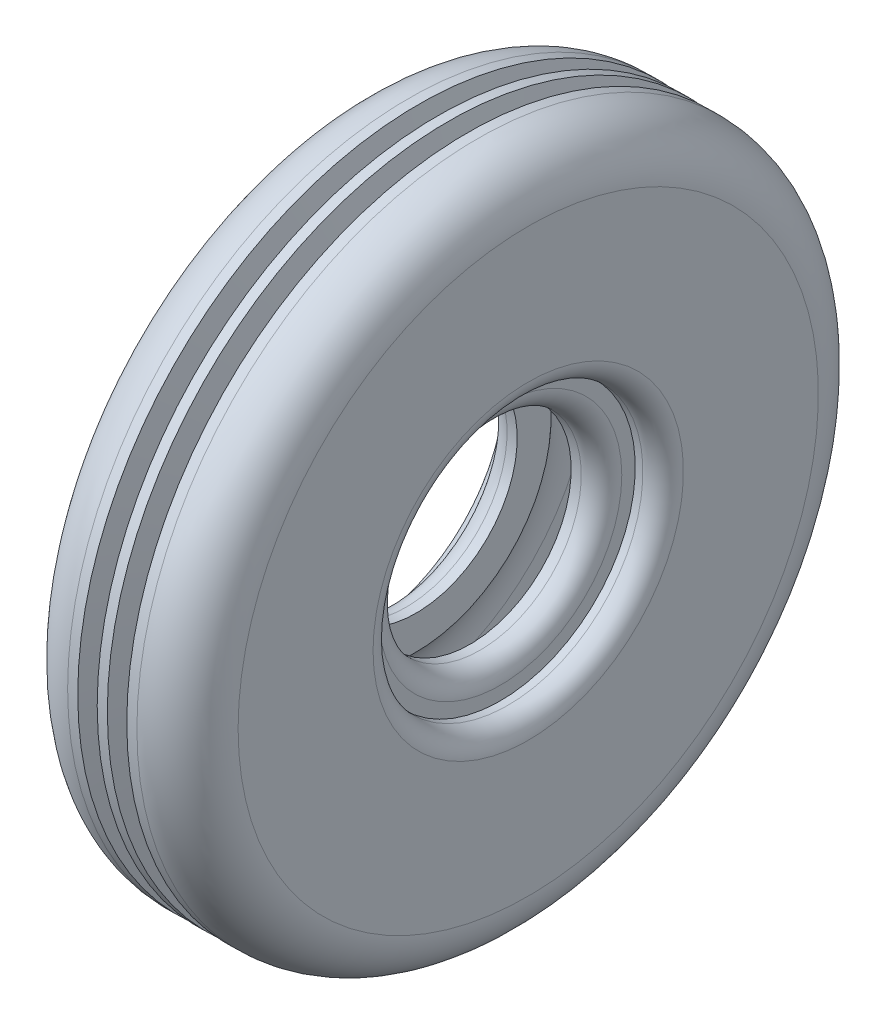
ISO-10303-21;
HEADER;
FILE_DESCRIPTION(('STEP AP214'),'2;1');
FILE_NAME('part.step','',(''),(''),'','','');
FILE_SCHEMA(('AUTOMOTIVE_DESIGN { 1 0 10303 214 1 1 1 1 }'));
ENDSEC;
DATA;
#1=APPLICATION_CONTEXT('core data for automotive mechanical design processes');
#2=APPLICATION_PROTOCOL_DEFINITION('international standard','automotive_design',2000,#1);
#3=PRODUCT_CONTEXT('',#1,'mechanical');
#4=PRODUCT('Part','Part','',(#3));
#5=PRODUCT_RELATED_PRODUCT_CATEGORY('part','',(#4));
#6=PRODUCT_DEFINITION_FORMATION('','',#4);
#7=PRODUCT_DEFINITION_CONTEXT('part definition',#1,'design');
#8=PRODUCT_DEFINITION('design','',#6,#7);
#9=PRODUCT_DEFINITION_SHAPE('','',#8);
#10=(LENGTH_UNIT() NAMED_UNIT(*) SI_UNIT(.MILLI.,.METRE.));
#11=(NAMED_UNIT(*) PLANE_ANGLE_UNIT() SI_UNIT($,.RADIAN.));
#12=(NAMED_UNIT(*) SI_UNIT($,.STERADIAN.) SOLID_ANGLE_UNIT());
#13=UNCERTAINTY_MEASURE_WITH_UNIT(LENGTH_MEASURE(1.E-05),#10,'distance_accuracy_value','');
#14=(GEOMETRIC_REPRESENTATION_CONTEXT(3) GLOBAL_UNCERTAINTY_ASSIGNED_CONTEXT((#13)) GLOBAL_UNIT_ASSIGNED_CONTEXT((#10,
#11,#12)) REPRESENTATION_CONTEXT('',''));
#15=CARTESIAN_POINT('',(0.,0.,0.));
#16=DIRECTION('',(0.,0.,1.));
#17=DIRECTION('',(1.,0.,0.));
#18=AXIS2_PLACEMENT_3D('',#15,#16,#17);
#19=CARTESIAN_POINT('',(166.89360179688,0.,0.));
#20=DIRECTION('',(-1.,0.,0.));
#21=DIRECTION('',(0.,0.,1.));
#22=AXIS2_PLACEMENT_3D('',#19,#20,#21);
#23=TOROIDAL_SURFACE('',#22,400.,30.);
#24=CARTESIAN_POINT('',(196.893601796879,0.,0.));
#25=DIRECTION('',(-1.,0.,0.));
#26=DIRECTION('',(0.,0.,1.));
#27=AXIS2_PLACEMENT_3D('',#24,#25,#26);
#28=CIRCLE('',#27,400.);
#29=CARTESIAN_POINT('',(196.893601796879,0.,400.));
#30=VERTEX_POINT('',#29);
#31=EDGE_CURVE('E140',#30,#30,#28,.T.);
#32=ORIENTED_EDGE('',*,*,#31,.F.);
#33=EDGE_LOOP('',(#32));
#34=FACE_BOUND('',#33,.T.);
#35=CARTESIAN_POINT('',(166.89360179688,0.,0.));
#36=DIRECTION('',(-1.,0.,0.));
#37=DIRECTION('',(0.,0.,1.));
#38=AXIS2_PLACEMENT_3D('',#35,#36,#37);
#39=CIRCLE('',#38,430.);
#40=CARTESIAN_POINT('',(166.89360179688,0.,430.));
#41=VERTEX_POINT('',#40);
#42=EDGE_CURVE('E10',#41,#41,#39,.T.);
#43=ORIENTED_EDGE('',*,*,#42,.T.);
#44=EDGE_LOOP('',(#43));
#45=FACE_BOUND('',#44,.T.);
#46=ADVANCED_FACE('F40',(#34,#45),#23,.F.);
#47=CARTESIAN_POINT('',(0.,0.,0.));
#48=DIRECTION('',(-1.,0.,0.));
#49=DIRECTION('',(0.,0.,1.));
#50=AXIS2_PLACEMENT_3D('',#47,#48,#49);
#51=CYLINDRICAL_SURFACE('',#50,430.);
#52=ORIENTED_EDGE('',*,*,#42,.F.);
#53=EDGE_LOOP('',(#52));
#54=FACE_BOUND('',#53,.T.);
#55=CARTESIAN_POINT('',(64.2383757738819,0.,0.));
#56=DIRECTION('',(-1.,0.,0.));
#57=DIRECTION('',(0.,0.,1.));
#58=AXIS2_PLACEMENT_3D('',#55,#56,#57);
#59=CIRCLE('',#58,430.);
#60=CARTESIAN_POINT('',(64.2383757738819,0.,430.));
#61=VERTEX_POINT('',#60);
#62=EDGE_CURVE('E43',#61,#61,#59,.T.);
#63=ORIENTED_EDGE('',*,*,#62,.T.);
#64=EDGE_LOOP('',(#63));
#65=FACE_BOUND('',#64,.T.);
#66=ADVANCED_FACE('F145',(#54,#65),#51,.F.);
#67=CARTESIAN_POINT('',(64.2383757738819,0.,0.));
#68=DIRECTION('',(-1.,0.,0.));
#69=DIRECTION('',(0.,0.,1.));
#70=AXIS2_PLACEMENT_3D('',#67,#68,#69);
#71=TOROIDAL_SURFACE('',#70,400.,30.);
#72=ORIENTED_EDGE('',*,*,#62,.F.);
#73=EDGE_LOOP('',(#72));
#74=FACE_BOUND('',#73,.T.);
#75=CARTESIAN_POINT('',(34.2383757738819,0.,0.));
#76=DIRECTION('',(-1.,0.,0.));
#77=DIRECTION('',(0.,0.,1.));
#78=AXIS2_PLACEMENT_3D('',#75,#76,#77);
#79=CIRCLE('',#78,400.);
#80=CARTESIAN_POINT('',(34.2383757738819,0.,400.));
#81=VERTEX_POINT('',#80);
#82=EDGE_CURVE('E50',#81,#81,#79,.T.);
#83=ORIENTED_EDGE('',*,*,#82,.T.);
#84=EDGE_LOOP('',(#83));
#85=FACE_BOUND('',#84,.T.);
#86=ADVANCED_FACE('F146',(#74,#85),#71,.F.);
#87=CARTESIAN_POINT('',(34.2383757738819,400.,0.));
#88=DIRECTION('',(-1.,0.,0.));
#89=DIRECTION('',(0.,0.,1.));
#90=AXIS2_PLACEMENT_3D('',#87,#88,#89);
#91=PLANE('',#90);
#92=ORIENTED_EDGE('',*,*,#82,.F.);
#93=EDGE_LOOP('',(#92));
#94=FACE_BOUND('',#93,.T.);
#95=CARTESIAN_POINT('',(34.2383757738819,0.,0.));
#96=DIRECTION('',(-1.,0.,0.));
#97=DIRECTION('',(0.,0.,1.));
#98=AXIS2_PLACEMENT_3D('',#95,#96,#97);
#99=CIRCLE('',#98,300.);
#100=CARTESIAN_POINT('',(34.2383757738819,0.,300.));
#101=VERTEX_POINT('',#100);
#102=EDGE_CURVE('E51',#101,#101,#99,.T.);
#103=ORIENTED_EDGE('',*,*,#102,.T.);
#104=EDGE_LOOP('',(#103));
#105=FACE_BOUND('',#104,.T.);
#106=ADVANCED_FACE('F153',(#94,#105),#91,.F.);
#107=CARTESIAN_POINT('',(175.886667848852,0.,0.));
#108=DIRECTION('',(-1.,0.,0.));
#109=DIRECTION('',(0.,0.,1.));
#110=AXIS2_PLACEMENT_3D('',#107,#108,#109);
#111=TOROIDAL_SURFACE('',#110,300.,141.64829207497);
#112=ORIENTED_EDGE('',*,*,#102,.F.);
#113=EDGE_LOOP('',(#112));
#114=FACE_BOUND('',#113,.T.);
#115=CARTESIAN_POINT('',(75.5659887853808,0.,0.));
#116=DIRECTION('',(-1.,0.,0.));
#117=DIRECTION('',(0.,0.,1.));
#118=AXIS2_PLACEMENT_3D('',#115,#116,#117);
#119=CIRCLE('',#118,200.);
#120=CARTESIAN_POINT('',(75.5659887853808,0.,200.));
#121=VERTEX_POINT('',#120);
#122=EDGE_CURVE('E57',#121,#121,#119,.T.);
#123=ORIENTED_EDGE('',*,*,#122,.T.);
#124=EDGE_LOOP('',(#123));
#125=FACE_BOUND('',#124,.T.);
#126=ADVANCED_FACE('F157',(#114,#125),#111,.F.);
#127=CARTESIAN_POINT('',(75.5659887853808,150.,0.));
#128=DIRECTION('',(-1.,0.,0.));
#129=DIRECTION('',(0.,0.,1.));
#130=AXIS2_PLACEMENT_3D('',#127,#128,#129);
#131=PLANE('',#130);
#132=ORIENTED_EDGE('',*,*,#122,.F.);
#133=EDGE_LOOP('',(#132));
#134=FACE_BOUND('',#133,.T.);
#135=CARTESIAN_POINT('',(75.5659887853808,0.,0.));
#136=DIRECTION('',(-1.,0.,0.));
#137=DIRECTION('',(0.,0.,1.));
#138=AXIS2_PLACEMENT_3D('',#135,#136,#137);
#139=CIRCLE('',#138,150.);
#140=CARTESIAN_POINT('',(75.5659887853808,0.,150.));
#141=VERTEX_POINT('',#140);
#142=EDGE_CURVE('E56',#141,#141,#139,.T.);
#143=ORIENTED_EDGE('',*,*,#142,.T.);
#144=EDGE_LOOP('',(#143));
#145=FACE_BOUND('',#144,.T.);
#146=ADVANCED_FACE('F162',(#134,#145),#131,.F.);
#147=CARTESIAN_POINT('',(0.,0.,0.));
#148=DIRECTION('',(-1.,0.,0.));
#149=DIRECTION('',(0.,0.,1.));
#150=AXIS2_PLACEMENT_3D('',#147,#148,#149);
#151=CYLINDRICAL_SURFACE('',#150,150.);
#152=ORIENTED_EDGE('',*,*,#142,.F.);
#153=EDGE_LOOP('',(#152));
#154=FACE_BOUND('',#153,.T.);
#155=CARTESIAN_POINT('',(60.5659887853808,0.,0.));
#156=DIRECTION('',(-1.,0.,0.));
#157=DIRECTION('',(0.,0.,1.));
#158=AXIS2_PLACEMENT_3D('',#155,#156,#157);
#159=CIRCLE('',#158,150.);
#160=CARTESIAN_POINT('',(60.5659887853808,0.,150.));
#161=VERTEX_POINT('',#160);
#162=EDGE_CURVE('E64',#161,#161,#159,.T.);
#163=ORIENTED_EDGE('',*,*,#162,.T.);
#164=EDGE_LOOP('',(#163));
#165=FACE_BOUND('',#164,.T.);
#166=ADVANCED_FACE('F170',(#154,#165),#151,.F.);
#167=CARTESIAN_POINT('',(60.5659887853808,0.,0.));
#168=DIRECTION('',(-1.,0.,0.));
#169=DIRECTION('',(0.,0.,1.));
#170=AXIS2_PLACEMENT_3D('',#167,#168,#169);
#171=TOROIDAL_SURFACE('',#170,180.,30.);
#172=ORIENTED_EDGE('',*,*,#162,.F.);
#173=EDGE_LOOP('',(#172));
#174=FACE_BOUND('',#173,.T.);
#175=CARTESIAN_POINT('',(30.5659887853808,0.,0.));
#176=DIRECTION('',(-1.,0.,0.));
#177=DIRECTION('',(0.,0.,1.));
#178=AXIS2_PLACEMENT_3D('',#175,#176,#177);
#179=CIRCLE('',#178,180.);
#180=CARTESIAN_POINT('',(30.5659887853808,0.,180.));
#181=VERTEX_POINT('',#180);
#182=EDGE_CURVE('E61',#181,#181,#179,.T.);
#183=ORIENTED_EDGE('',*,*,#182,.T.);
#184=EDGE_LOOP('',(#183));
#185=FACE_BOUND('',#184,.T.);
#186=ADVANCED_FACE('F173',(#174,#185),#171,.T.);
#187=CARTESIAN_POINT('',(30.5659887853808,200.,0.));
#188=DIRECTION('',(1.,0.,0.));
#189=DIRECTION('',(0.,0.,-1.));
#190=AXIS2_PLACEMENT_3D('',#187,#188,#189);
#191=PLANE('',#190);
#192=ORIENTED_EDGE('',*,*,#182,.F.);
#193=EDGE_LOOP('',(#192));
#194=FACE_BOUND('',#193,.T.);
#195=CARTESIAN_POINT('',(30.5659887853808,0.,0.));
#196=DIRECTION('',(-1.,0.,0.));
#197=DIRECTION('',(0.,0.,1.));
#198=AXIS2_PLACEMENT_3D('',#195,#196,#197);
#199=CIRCLE('',#198,200.);
#200=CARTESIAN_POINT('',(30.5659887853808,0.,200.));
#201=VERTEX_POINT('',#200);
#202=EDGE_CURVE('E66',#201,#201,#199,.T.);
#203=ORIENTED_EDGE('',*,*,#202,.T.);
#204=EDGE_LOOP('',(#203));
#205=FACE_BOUND('',#204,.T.);
#206=ADVANCED_FACE('F171',(#194,#205),#191,.F.);
#207=CARTESIAN_POINT('',(0.,0.,0.));
#208=DIRECTION('',(-1.,0.,0.));
#209=DIRECTION('',(0.,0.,1.));
#210=AXIS2_PLACEMENT_3D('',#207,#208,#209);
#211=CYLINDRICAL_SURFACE('',#210,200.);
#212=ORIENTED_EDGE('',*,*,#202,.F.);
#213=EDGE_LOOP('',(#212));
#214=FACE_BOUND('',#213,.T.);
#215=CARTESIAN_POINT('',(19.238375773882,0.,0.));
#216=DIRECTION('',(-1.,0.,0.));
#217=DIRECTION('',(0.,0.,1.));
#218=AXIS2_PLACEMENT_3D('',#215,#216,#217);
#219=CIRCLE('',#218,200.);
#220=CARTESIAN_POINT('',(19.238375773882,0.,200.));
#221=VERTEX_POINT('',#220);
#222=EDGE_CURVE('E72',#221,#221,#219,.T.);
#223=ORIENTED_EDGE('',*,*,#222,.T.);
#224=EDGE_LOOP('',(#223));
#225=FACE_BOUND('',#224,.T.);
#226=ADVANCED_FACE('F177',(#214,#225),#211,.F.);
#227=CARTESIAN_POINT('',(19.238375773882,0.,0.));
#228=DIRECTION('',(-1.,0.,0.));
#229=DIRECTION('',(0.,0.,1.));
#230=AXIS2_PLACEMENT_3D('',#227,#228,#229);
#231=TOROIDAL_SURFACE('',#230,230.,30.);
#232=ORIENTED_EDGE('',*,*,#222,.F.);
#233=EDGE_LOOP('',(#232));
#234=FACE_BOUND('',#233,.T.);
#235=CARTESIAN_POINT('',(-10.761624226118,0.,0.));
#236=DIRECTION('',(-1.,0.,0.));
#237=DIRECTION('',(0.,0.,1.));
#238=AXIS2_PLACEMENT_3D('',#235,#236,#237);
#239=CIRCLE('',#238,230.);
#240=CARTESIAN_POINT('',(-10.761624226118,0.,230.));
#241=VERTEX_POINT('',#240);
#242=EDGE_CURVE('E74',#241,#241,#239,.T.);
#243=ORIENTED_EDGE('',*,*,#242,.T.);
#244=EDGE_LOOP('',(#243));
#245=FACE_BOUND('',#244,.T.);
#246=ADVANCED_FACE('F181',(#234,#245),#231,.T.);
#247=CARTESIAN_POINT('',(-10.761624226118,430.,0.));
#248=DIRECTION('',(1.,0.,0.));
#249=DIRECTION('',(0.,0.,-1.));
#250=AXIS2_PLACEMENT_3D('',#247,#248,#249);
#251=PLANE('',#250);
#252=ORIENTED_EDGE('',*,*,#242,.F.);
#253=EDGE_LOOP('',(#252));
#254=FACE_BOUND('',#253,.T.);
#255=CARTESIAN_POINT('',(-10.7616242261181,0.,0.));
#256=DIRECTION('',(-1.,0.,0.));
#257=DIRECTION('',(0.,0.,1.));
#258=AXIS2_PLACEMENT_3D('',#255,#256,#257);
#259=CIRCLE('',#258,430.);
#260=CARTESIAN_POINT('',(-10.7616242261181,0.,430.));
#261=VERTEX_POINT('',#260);
#262=EDGE_CURVE('E79',#261,#261,#259,.T.);
#263=ORIENTED_EDGE('',*,*,#262,.T.);
#264=EDGE_LOOP('',(#263));
#265=FACE_BOUND('',#264,.T.);
#266=ADVANCED_FACE('F189',(#254,#265),#251,.F.);
#267=CARTESIAN_POINT('',(64.2383757738819,0.,0.));
#268=DIRECTION('',(-1.,0.,0.));
#269=DIRECTION('',(0.,0.,1.));
#270=AXIS2_PLACEMENT_3D('',#267,#268,#269);
#271=TOROIDAL_SURFACE('',#270,430.,75.);
#272=ORIENTED_EDGE('',*,*,#262,.F.);
#273=EDGE_LOOP('',(#272));
#274=FACE_BOUND('',#273,.T.);
#275=CARTESIAN_POINT('',(64.2383757738819,0.,0.));
#276=DIRECTION('',(-1.,0.,0.));
#277=DIRECTION('',(0.,0.,1.));
#278=AXIS2_PLACEMENT_3D('',#275,#276,#277);
#279=CIRCLE('',#278,505.);
#280=CARTESIAN_POINT('',(64.2383757738819,0.,505.));
#281=VERTEX_POINT('',#280);
#282=EDGE_CURVE('E76',#281,#281,#279,.T.);
#283=ORIENTED_EDGE('',*,*,#282,.T.);
#284=EDGE_LOOP('',(#283));
#285=FACE_BOUND('',#284,.T.);
#286=ADVANCED_FACE('F193',(#274,#285),#271,.T.);
#287=CARTESIAN_POINT('',(0.,0.,0.));
#288=DIRECTION('',(-1.,0.,0.));
#289=DIRECTION('',(0.,0.,1.));
#290=AXIS2_PLACEMENT_3D('',#287,#288,#289);
#291=CYLINDRICAL_SURFACE('',#290,505.);
#292=ORIENTED_EDGE('',*,*,#282,.F.);
#293=EDGE_LOOP('',(#292));
#294=FACE_BOUND('',#293,.T.);
#295=CARTESIAN_POINT('',(79.2383757738819,0.,0.));
#296=DIRECTION('',(-1.,0.,0.));
#297=DIRECTION('',(0.,0.,1.));
#298=AXIS2_PLACEMENT_3D('',#295,#296,#297);
#299=CIRCLE('',#298,505.);
#300=CARTESIAN_POINT('',(79.2383757738819,0.,505.));
#301=VERTEX_POINT('',#300);
#302=EDGE_CURVE('E81',#301,#301,#299,.T.);
#303=ORIENTED_EDGE('',*,*,#302,.T.);
#304=EDGE_LOOP('',(#303));
#305=FACE_BOUND('',#304,.T.);
#306=ADVANCED_FACE('F194',(#294,#305),#291,.T.);
#307=CARTESIAN_POINT('',(88.6521822796312,0.,0.));
#308=DIRECTION('',(-1.,0.,0.));
#309=DIRECTION('',(0.,0.,1.));
#310=AXIS2_PLACEMENT_3D('',#307,#308,#309);
#311=CONICAL_SURFACE('',#310,466.12352578908,1.33322263615598);
#312=ORIENTED_EDGE('',*,*,#302,.F.);
#313=EDGE_LOOP('',(#312));
#314=FACE_BOUND('',#313,.T.);
#315=CARTESIAN_POINT('',(88.6521822796312,0.,0.));
#316=DIRECTION('',(-1.,0.,0.));
#317=DIRECTION('',(0.,0.,1.));
#318=AXIS2_PLACEMENT_3D('',#315,#316,#317);
#319=CIRCLE('',#318,466.12352578908);
#320=CARTESIAN_POINT('',(88.6521822796312,0.,466.12352578908));
#321=VERTEX_POINT('',#320);
#322=EDGE_CURVE('E88',#321,#321,#319,.T.);
#323=ORIENTED_EDGE('',*,*,#322,.T.);
#324=EDGE_LOOP('',(#323));
#325=FACE_BOUND('',#324,.T.);
#326=ADVANCED_FACE('F200',(#314,#325),#311,.T.);
#327=CARTESIAN_POINT('',(0.,0.,0.));
#328=DIRECTION('',(-1.,0.,0.));
#329=DIRECTION('',(0.,0.,1.));
#330=AXIS2_PLACEMENT_3D('',#327,#328,#329);
#331=CYLINDRICAL_SURFACE('',#330,466.12352578908);
#332=ORIENTED_EDGE('',*,*,#322,.F.);
#333=EDGE_LOOP('',(#332));
#334=FACE_BOUND('',#333,.T.);
#335=CARTESIAN_POINT('',(98.6521822796312,0.,0.));
#336=DIRECTION('',(-1.,0.,0.));
#337=DIRECTION('',(0.,0.,1.));
#338=AXIS2_PLACEMENT_3D('',#335,#336,#337);
#339=CIRCLE('',#338,466.12352578908);
#340=CARTESIAN_POINT('',(98.6521822796312,0.,466.12352578908));
#341=VERTEX_POINT('',#340);
#342=EDGE_CURVE('E90',#341,#341,#339,.T.);
#343=ORIENTED_EDGE('',*,*,#342,.T.);
#344=EDGE_LOOP('',(#343));
#345=FACE_BOUND('',#344,.T.);
#346=ADVANCED_FACE('F201',(#334,#345),#331,.T.);
#347=CARTESIAN_POINT('',(108.065988785381,0.,0.));
#348=DIRECTION('',(1.,0.,0.));
#349=DIRECTION('',(0.,0.,-1.));
#350=AXIS2_PLACEMENT_3D('',#347,#348,#349);
#351=CONICAL_SURFACE('',#350,505.,1.33322263615598);
#352=ORIENTED_EDGE('',*,*,#342,.F.);
#353=EDGE_LOOP('',(#352));
#354=FACE_BOUND('',#353,.T.);
#355=CARTESIAN_POINT('',(108.065988785381,0.,0.));
#356=DIRECTION('',(-1.,0.,0.));
#357=DIRECTION('',(0.,0.,1.));
#358=AXIS2_PLACEMENT_3D('',#355,#356,#357);
#359=CIRCLE('',#358,505.);
#360=CARTESIAN_POINT('',(108.065988785381,0.,505.));
#361=VERTEX_POINT('',#360);
#362=EDGE_CURVE('E95',#361,#361,#359,.T.);
#363=ORIENTED_EDGE('',*,*,#362,.T.);
#364=EDGE_LOOP('',(#363));
#365=FACE_BOUND('',#364,.T.);
#366=ADVANCED_FACE('F210',(#354,#365),#351,.T.);
#367=CARTESIAN_POINT('',(0.,0.,0.));
#368=DIRECTION('',(-1.,0.,0.));
#369=DIRECTION('',(0.,0.,1.));
#370=AXIS2_PLACEMENT_3D('',#367,#368,#369);
#371=CYLINDRICAL_SURFACE('',#370,505.);
#372=ORIENTED_EDGE('',*,*,#362,.F.);
#373=EDGE_LOOP('',(#372));
#374=FACE_BOUND('',#373,.T.);
#375=CARTESIAN_POINT('',(123.065988785381,0.,0.));
#376=DIRECTION('',(-1.,0.,0.));
#377=DIRECTION('',(0.,0.,1.));
#378=AXIS2_PLACEMENT_3D('',#375,#376,#377);
#379=CIRCLE('',#378,505.);
#380=CARTESIAN_POINT('',(123.065988785381,0.,505.));
#381=VERTEX_POINT('',#380);
#382=EDGE_CURVE('E92',#381,#381,#379,.T.);
#383=ORIENTED_EDGE('',*,*,#382,.T.);
#384=EDGE_LOOP('',(#383));
#385=FACE_BOUND('',#384,.T.);
#386=ADVANCED_FACE('F211',(#374,#385),#371,.T.);
#387=CARTESIAN_POINT('',(132.47979529113,0.,0.));
#388=DIRECTION('',(-1.,0.,0.));
#389=DIRECTION('',(0.,0.,1.));
#390=AXIS2_PLACEMENT_3D('',#387,#388,#389);
#391=CONICAL_SURFACE('',#390,466.12352578908,1.33322263615597);
#392=ORIENTED_EDGE('',*,*,#382,.F.);
#393=EDGE_LOOP('',(#392));
#394=FACE_BOUND('',#393,.T.);
#395=CARTESIAN_POINT('',(132.47979529113,0.,0.));
#396=DIRECTION('',(-1.,0.,0.));
#397=DIRECTION('',(0.,0.,1.));
#398=AXIS2_PLACEMENT_3D('',#395,#396,#397);
#399=CIRCLE('',#398,466.12352578908);
#400=CARTESIAN_POINT('',(132.47979529113,0.,466.12352578908));
#401=VERTEX_POINT('',#400);
#402=EDGE_CURVE('E98',#401,#401,#399,.T.);
#403=ORIENTED_EDGE('',*,*,#402,.T.);
#404=EDGE_LOOP('',(#403));
#405=FACE_BOUND('',#404,.T.);
#406=ADVANCED_FACE('F214',(#394,#405),#391,.T.);
#407=CARTESIAN_POINT('',(0.,0.,0.));
#408=DIRECTION('',(-1.,0.,0.));
#409=DIRECTION('',(0.,0.,1.));
#410=AXIS2_PLACEMENT_3D('',#407,#408,#409);
#411=CYLINDRICAL_SURFACE('',#410,466.12352578908);
#412=ORIENTED_EDGE('',*,*,#402,.F.);
#413=EDGE_LOOP('',(#412));
#414=FACE_BOUND('',#413,.T.);
#415=CARTESIAN_POINT('',(142.47979529113,0.,0.));
#416=DIRECTION('',(-1.,0.,0.));
#417=DIRECTION('',(0.,0.,1.));
#418=AXIS2_PLACEMENT_3D('',#415,#416,#417);
#419=CIRCLE('',#418,466.12352578908);
#420=CARTESIAN_POINT('',(142.47979529113,0.,466.12352578908));
#421=VERTEX_POINT('',#420);
#422=EDGE_CURVE('E101',#421,#421,#419,.T.);
#423=ORIENTED_EDGE('',*,*,#422,.T.);
#424=EDGE_LOOP('',(#423));
#425=FACE_BOUND('',#424,.T.);
#426=ADVANCED_FACE('F218',(#414,#425),#411,.T.);
#427=CARTESIAN_POINT('',(151.893601796879,0.,0.));
#428=DIRECTION('',(1.,0.,0.));
#429=DIRECTION('',(0.,0.,-1.));
#430=AXIS2_PLACEMENT_3D('',#427,#428,#429);
#431=CONICAL_SURFACE('',#430,505.,1.33322263615597);
#432=ORIENTED_EDGE('',*,*,#422,.F.);
#433=EDGE_LOOP('',(#432));
#434=FACE_BOUND('',#433,.T.);
#435=CARTESIAN_POINT('',(151.893601796879,0.,0.));
#436=DIRECTION('',(-1.,0.,0.));
#437=DIRECTION('',(0.,0.,1.));
#438=AXIS2_PLACEMENT_3D('',#435,#436,#437);
#439=CIRCLE('',#438,505.);
#440=CARTESIAN_POINT('',(151.893601796879,0.,505.));
#441=VERTEX_POINT('',#440);
#442=EDGE_CURVE('E102',#441,#441,#439,.T.);
#443=ORIENTED_EDGE('',*,*,#442,.T.);
#444=EDGE_LOOP('',(#443));
#445=FACE_BOUND('',#444,.T.);
#446=ADVANCED_FACE('F224',(#434,#445),#431,.T.);
#447=CARTESIAN_POINT('',(0.,0.,0.));
#448=DIRECTION('',(-1.,0.,0.));
#449=DIRECTION('',(0.,0.,1.));
#450=AXIS2_PLACEMENT_3D('',#447,#448,#449);
#451=CYLINDRICAL_SURFACE('',#450,505.);
#452=ORIENTED_EDGE('',*,*,#442,.F.);
#453=EDGE_LOOP('',(#452));
#454=FACE_BOUND('',#453,.T.);
#455=CARTESIAN_POINT('',(166.893601796879,0.,0.));
#456=DIRECTION('',(-1.,0.,0.));
#457=DIRECTION('',(0.,0.,1.));
#458=AXIS2_PLACEMENT_3D('',#455,#456,#457);
#459=CIRCLE('',#458,505.);
#460=CARTESIAN_POINT('',(166.893601796879,0.,505.));
#461=VERTEX_POINT('',#460);
#462=EDGE_CURVE('E110',#461,#461,#459,.T.);
#463=ORIENTED_EDGE('',*,*,#462,.T.);
#464=EDGE_LOOP('',(#463));
#465=FACE_BOUND('',#464,.T.);
#466=ADVANCED_FACE('F229',(#454,#465),#451,.T.);
#467=CARTESIAN_POINT('',(166.89360179688,0.,0.));
#468=DIRECTION('',(-1.,0.,0.));
#469=DIRECTION('',(0.,0.,1.));
#470=AXIS2_PLACEMENT_3D('',#467,#468,#469);
#471=TOROIDAL_SURFACE('',#470,430.,75.);
#472=ORIENTED_EDGE('',*,*,#462,.F.);
#473=EDGE_LOOP('',(#472));
#474=FACE_BOUND('',#473,.T.);
#475=CARTESIAN_POINT('',(241.893601796879,0.,0.));
#476=DIRECTION('',(-1.,0.,0.));
#477=DIRECTION('',(0.,0.,1.));
#478=AXIS2_PLACEMENT_3D('',#475,#476,#477);
#479=CIRCLE('',#478,430.);
#480=CARTESIAN_POINT('',(241.893601796879,0.,430.));
#481=VERTEX_POINT('',#480);
#482=EDGE_CURVE('E109',#481,#481,#479,.T.);
#483=ORIENTED_EDGE('',*,*,#482,.T.);
#484=EDGE_LOOP('',(#483));
#485=FACE_BOUND('',#484,.T.);
#486=ADVANCED_FACE('F233',(#474,#485),#471,.T.);
#487=CARTESIAN_POINT('',(241.89360179688,230.,0.));
#488=DIRECTION('',(-1.,0.,0.));
#489=DIRECTION('',(0.,0.,1.));
#490=AXIS2_PLACEMENT_3D('',#487,#488,#489);
#491=PLANE('',#490);
#492=ORIENTED_EDGE('',*,*,#482,.F.);
#493=EDGE_LOOP('',(#492));
#494=FACE_BOUND('',#493,.T.);
#495=CARTESIAN_POINT('',(241.89360179688,0.,0.));
#496=DIRECTION('',(-1.,0.,0.));
#497=DIRECTION('',(0.,0.,1.));
#498=AXIS2_PLACEMENT_3D('',#495,#496,#497);
#499=CIRCLE('',#498,230.);
#500=CARTESIAN_POINT('',(241.89360179688,0.,230.));
#501=VERTEX_POINT('',#500);
#502=EDGE_CURVE('E114',#501,#501,#499,.T.);
#503=ORIENTED_EDGE('',*,*,#502,.T.);
#504=EDGE_LOOP('',(#503));
#505=FACE_BOUND('',#504,.T.);
#506=ADVANCED_FACE('F234',(#494,#505),#491,.F.);
#507=CARTESIAN_POINT('',(211.89360179688,0.,0.));
#508=DIRECTION('',(-1.,0.,0.));
#509=DIRECTION('',(0.,0.,1.));
#510=AXIS2_PLACEMENT_3D('',#507,#508,#509);
#511=TOROIDAL_SURFACE('',#510,230.,30.);
#512=ORIENTED_EDGE('',*,*,#502,.F.);
#513=EDGE_LOOP('',(#512));
#514=FACE_BOUND('',#513,.T.);
#515=CARTESIAN_POINT('',(211.89360179688,0.,0.));
#516=DIRECTION('',(-1.,0.,0.));
#517=DIRECTION('',(0.,0.,1.));
#518=AXIS2_PLACEMENT_3D('',#515,#516,#517);
#519=CIRCLE('',#518,200.);
#520=CARTESIAN_POINT('',(211.89360179688,0.,200.));
#521=VERTEX_POINT('',#520);
#522=EDGE_CURVE('E118',#521,#521,#519,.T.);
#523=ORIENTED_EDGE('',*,*,#522,.T.);
#524=EDGE_LOOP('',(#523));
#525=FACE_BOUND('',#524,.T.);
#526=ADVANCED_FACE('F239',(#514,#525),#511,.T.);
#527=CARTESIAN_POINT('',(0.,0.,0.));
#528=DIRECTION('',(-1.,0.,0.));
#529=DIRECTION('',(0.,0.,1.));
#530=AXIS2_PLACEMENT_3D('',#527,#528,#529);
#531=CYLINDRICAL_SURFACE('',#530,200.);
#532=ORIENTED_EDGE('',*,*,#522,.F.);
#533=EDGE_LOOP('',(#532));
#534=FACE_BOUND('',#533,.T.);
#535=CARTESIAN_POINT('',(200.565988785381,0.,0.));
#536=DIRECTION('',(-1.,0.,0.));
#537=DIRECTION('',(0.,0.,1.));
#538=AXIS2_PLACEMENT_3D('',#535,#536,#537);
#539=CIRCLE('',#538,200.);
#540=CARTESIAN_POINT('',(200.565988785381,0.,200.));
#541=VERTEX_POINT('',#540);
#542=EDGE_CURVE('E120',#541,#541,#539,.T.);
#543=ORIENTED_EDGE('',*,*,#542,.T.);
#544=EDGE_LOOP('',(#543));
#545=FACE_BOUND('',#544,.T.);
#546=ADVANCED_FACE('F242',(#534,#545),#531,.F.);
#547=CARTESIAN_POINT('',(200.565988785381,200.,0.));
#548=DIRECTION('',(-1.,0.,0.));
#549=DIRECTION('',(0.,0.,1.));
#550=AXIS2_PLACEMENT_3D('',#547,#548,#549);
#551=PLANE('',#550);
#552=ORIENTED_EDGE('',*,*,#542,.F.);
#553=EDGE_LOOP('',(#552));
#554=FACE_BOUND('',#553,.T.);
#555=CARTESIAN_POINT('',(200.565988785381,0.,0.));
#556=DIRECTION('',(-1.,0.,0.));
#557=DIRECTION('',(0.,0.,1.));
#558=AXIS2_PLACEMENT_3D('',#555,#556,#557);
#559=CIRCLE('',#558,180.);
#560=CARTESIAN_POINT('',(200.565988785381,0.,180.));
#561=VERTEX_POINT('',#560);
#562=EDGE_CURVE('E125',#561,#561,#559,.T.);
#563=ORIENTED_EDGE('',*,*,#562,.T.);
#564=EDGE_LOOP('',(#563));
#565=FACE_BOUND('',#564,.T.);
#566=ADVANCED_FACE('F250',(#554,#565),#551,.F.);
#567=CARTESIAN_POINT('',(170.565988785381,0.,0.));
#568=DIRECTION('',(-1.,0.,0.));
#569=DIRECTION('',(0.,0.,1.));
#570=AXIS2_PLACEMENT_3D('',#567,#568,#569);
#571=TOROIDAL_SURFACE('',#570,180.,30.);
#572=ORIENTED_EDGE('',*,*,#562,.F.);
#573=EDGE_LOOP('',(#572));
#574=FACE_BOUND('',#573,.T.);
#575=CARTESIAN_POINT('',(170.565988785381,0.,0.));
#576=DIRECTION('',(-1.,0.,0.));
#577=DIRECTION('',(0.,0.,1.));
#578=AXIS2_PLACEMENT_3D('',#575,#576,#577);
#579=CIRCLE('',#578,150.);
#580=CARTESIAN_POINT('',(170.565988785381,0.,150.));
#581=VERTEX_POINT('',#580);
#582=EDGE_CURVE('E124',#581,#581,#579,.T.);
#583=ORIENTED_EDGE('',*,*,#582,.T.);
#584=EDGE_LOOP('',(#583));
#585=FACE_BOUND('',#584,.T.);
#586=ADVANCED_FACE('F253',(#574,#585),#571,.T.);
#587=CARTESIAN_POINT('',(0.,0.,0.));
#588=DIRECTION('',(-1.,0.,0.));
#589=DIRECTION('',(0.,0.,1.));
#590=AXIS2_PLACEMENT_3D('',#587,#588,#589);
#591=CYLINDRICAL_SURFACE('',#590,150.);
#592=ORIENTED_EDGE('',*,*,#582,.F.);
#593=EDGE_LOOP('',(#592));
#594=FACE_BOUND('',#593,.T.);
#595=CARTESIAN_POINT('',(155.565988785381,0.,0.));
#596=DIRECTION('',(-1.,0.,0.));
#597=DIRECTION('',(0.,0.,1.));
#598=AXIS2_PLACEMENT_3D('',#595,#596,#597);
#599=CIRCLE('',#598,150.);
#600=CARTESIAN_POINT('',(155.565988785381,0.,150.));
#601=VERTEX_POINT('',#600);
#602=EDGE_CURVE('E126',#601,#601,#599,.T.);
#603=ORIENTED_EDGE('',*,*,#602,.T.);
#604=EDGE_LOOP('',(#603));
#605=FACE_BOUND('',#604,.T.);
#606=ADVANCED_FACE('F254',(#594,#605),#591,.F.);
#607=CARTESIAN_POINT('',(155.565988785381,200.,0.));
#608=DIRECTION('',(1.,0.,0.));
#609=DIRECTION('',(0.,0.,-1.));
#610=AXIS2_PLACEMENT_3D('',#607,#608,#609);
#611=PLANE('',#610);
#612=ORIENTED_EDGE('',*,*,#602,.F.);
#613=EDGE_LOOP('',(#612));
#614=FACE_BOUND('',#613,.T.);
#615=CARTESIAN_POINT('',(155.565988785381,0.,0.));
#616=DIRECTION('',(-1.,0.,0.));
#617=DIRECTION('',(0.,0.,1.));
#618=AXIS2_PLACEMENT_3D('',#615,#616,#617);
#619=CIRCLE('',#618,200.);
#620=CARTESIAN_POINT('',(155.565988785381,0.,200.));
#621=VERTEX_POINT('',#620);
#622=EDGE_CURVE('E133',#621,#621,#619,.T.);
#623=ORIENTED_EDGE('',*,*,#622,.T.);
#624=EDGE_LOOP('',(#623));
#625=FACE_BOUND('',#624,.T.);
#626=ADVANCED_FACE('F259',(#614,#625),#611,.F.);
#627=CARTESIAN_POINT('',(55.2453097219091,0.,0.));
#628=DIRECTION('',(-1.,0.,0.));
#629=DIRECTION('',(0.,0.,1.));
#630=AXIS2_PLACEMENT_3D('',#627,#628,#629);
#631=TOROIDAL_SURFACE('',#630,300.,141.64829207497);
#632=ORIENTED_EDGE('',*,*,#622,.F.);
#633=EDGE_LOOP('',(#632));
#634=FACE_BOUND('',#633,.T.);
#635=CARTESIAN_POINT('',(196.893601796879,0.,0.));
#636=DIRECTION('',(-1.,0.,0.));
#637=DIRECTION('',(0.,0.,1.));
#638=AXIS2_PLACEMENT_3D('',#635,#636,#637);
#639=CIRCLE('',#638,300.);
#640=CARTESIAN_POINT('',(196.893601796879,0.,300.));
#641=VERTEX_POINT('',#640);
#642=EDGE_CURVE('E135',#641,#641,#639,.T.);
#643=ORIENTED_EDGE('',*,*,#642,.T.);
#644=EDGE_LOOP('',(#643));
#645=FACE_BOUND('',#644,.T.);
#646=ADVANCED_FACE('F263',(#634,#645),#631,.F.);
#647=CARTESIAN_POINT('',(196.893601796879,400.,0.));
#648=DIRECTION('',(1.,0.,0.));
#649=DIRECTION('',(0.,0.,-1.));
#650=AXIS2_PLACEMENT_3D('',#647,#648,#649);
#651=PLANE('',#650);
#652=ORIENTED_EDGE('',*,*,#642,.F.);
#653=EDGE_LOOP('',(#652));
#654=FACE_BOUND('',#653,.T.);
#655=ORIENTED_EDGE('',*,*,#31,.T.);
#656=EDGE_LOOP('',(#655));
#657=FACE_BOUND('',#656,.T.);
#658=ADVANCED_FACE('F143',(#654,#657),#651,.F.);
#659=CLOSED_SHELL('',(#46,#66,#86,#106,#126,#146,#166,#186,#206,#226,#246,#266,#286,#306,#326,
#346,#366,#386,#406,#426,#446,#466,#486,#506,#526,#546,#566,#586,#606,#626,#646,#658));
#660=MANIFOLD_SOLID_BREP('B2',#659);
#661=ADVANCED_BREP_SHAPE_REPRESENTATION('',(#18,#660),#14);
#662=SHAPE_DEFINITION_REPRESENTATION(#9,#661);
ENDSEC;
END-ISO-10303-21;
